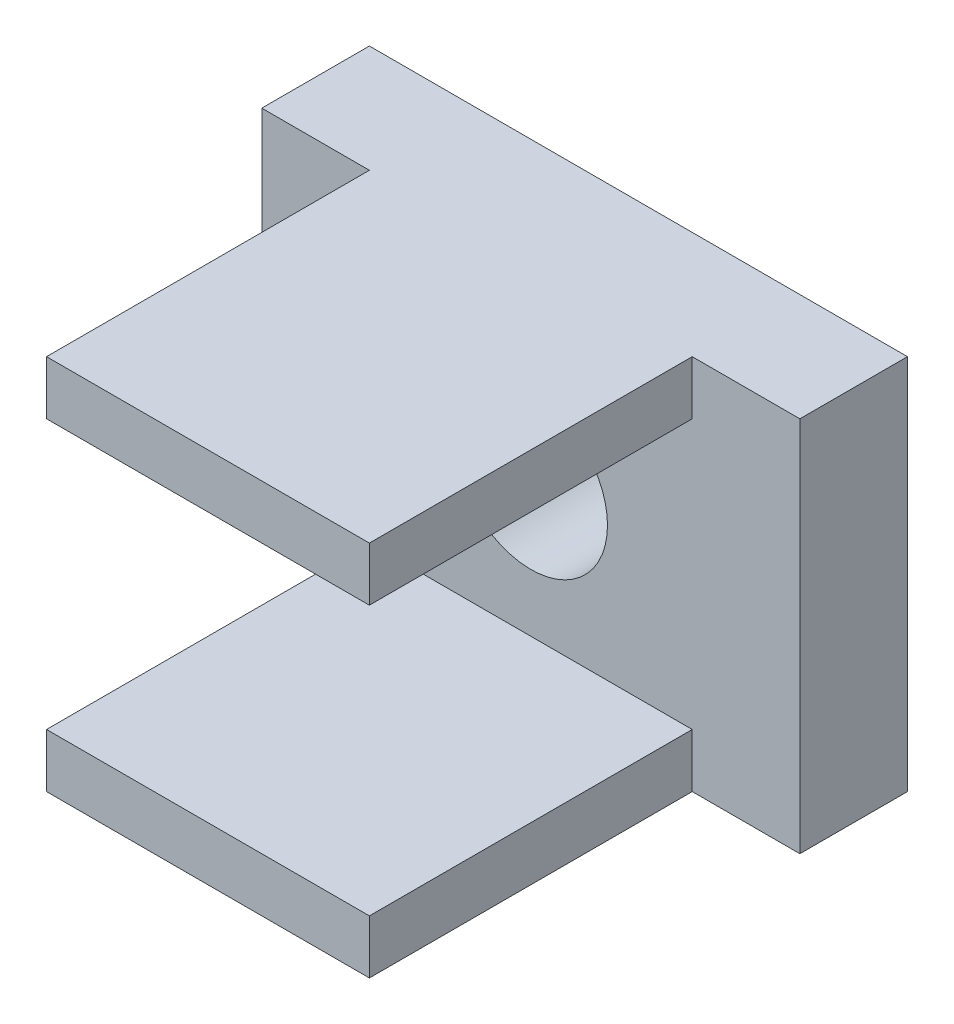
ISO-10303-21;
HEADER;
FILE_DESCRIPTION(('STEP AP214'),'2;1');
FILE_NAME('part.step','',(''),(''),'','','');
FILE_SCHEMA(('AUTOMOTIVE_DESIGN { 1 0 10303 214 1 1 1 1 }'));
ENDSEC;
DATA;
#1=APPLICATION_CONTEXT('core data for automotive mechanical design processes');
#2=APPLICATION_PROTOCOL_DEFINITION('international standard','automotive_design',2000,#1);
#3=PRODUCT_CONTEXT('',#1,'mechanical');
#4=PRODUCT('Part','Part','',(#3));
#5=PRODUCT_RELATED_PRODUCT_CATEGORY('part','',(#4));
#6=PRODUCT_DEFINITION_FORMATION('','',#4);
#7=PRODUCT_DEFINITION_CONTEXT('part definition',#1,'design');
#8=PRODUCT_DEFINITION('design','',#6,#7);
#9=PRODUCT_DEFINITION_SHAPE('','',#8);
#10=(LENGTH_UNIT() NAMED_UNIT(*) SI_UNIT(.MILLI.,.METRE.));
#11=(NAMED_UNIT(*) PLANE_ANGLE_UNIT() SI_UNIT($,.RADIAN.));
#12=(NAMED_UNIT(*) SI_UNIT($,.STERADIAN.) SOLID_ANGLE_UNIT());
#13=UNCERTAINTY_MEASURE_WITH_UNIT(LENGTH_MEASURE(1.E-05),#10,'distance_accuracy_value','');
#14=(GEOMETRIC_REPRESENTATION_CONTEXT(3) GLOBAL_UNCERTAINTY_ASSIGNED_CONTEXT((#13)) GLOBAL_UNIT_ASSIGNED_CONTEXT((#10,
#11,#12)) REPRESENTATION_CONTEXT('',''));
#15=CARTESIAN_POINT('',(0.,0.,0.));
#16=DIRECTION('',(0.,0.,1.));
#17=DIRECTION('',(1.,0.,0.));
#18=AXIS2_PLACEMENT_3D('',#15,#16,#17);
#19=CARTESIAN_POINT('',(0.,0.,1.));
#20=DIRECTION('',(0.,0.,-1.));
#21=DIRECTION('',(-1.,0.,0.));
#22=AXIS2_PLACEMENT_3D('',#19,#20,#21);
#23=PLANE('',#22);
#24=CARTESIAN_POINT('',(0.,0.,1.));
#25=DIRECTION('',(0.,0.,1.));
#26=DIRECTION('',(1.,0.,0.));
#27=AXIS2_PLACEMENT_3D('',#24,#25,#26);
#28=CIRCLE('',#27,1.425);
#29=CARTESIAN_POINT('',(1.425,0.,1.));
#30=VERTEX_POINT('',#29);
#31=EDGE_CURVE('E188',#30,#30,#28,.T.);
#32=ORIENTED_EDGE('',*,*,#31,.F.);
#33=EDGE_LOOP('',(#32));
#34=FACE_BOUND('',#33,.T.);
#35=DIRECTION('',(1.,0.,0.));
#36=VECTOR('',#35,1.);
#37=CARTESIAN_POINT('',(-3.,-2.5,1.));
#38=LINE('',#37,#36);
#39=CARTESIAN_POINT('',(-3.,-2.5,1.));
#40=VERTEX_POINT('',#39);
#41=CARTESIAN_POINT('',(3.,-2.5,1.));
#42=VERTEX_POINT('',#41);
#43=EDGE_CURVE('E49',#40,#42,#38,.T.);
#44=ORIENTED_EDGE('',*,*,#43,.T.);
#45=DIRECTION('',(0.,-1.,0.));
#46=VECTOR('',#45,1.);
#47=CARTESIAN_POINT('',(3.,-2.5,1.));
#48=LINE('',#47,#46);
#49=CARTESIAN_POINT('',(3.,-3.5,1.));
#50=VERTEX_POINT('',#49);
#51=EDGE_CURVE('E129',#42,#50,#48,.T.);
#52=ORIENTED_EDGE('',*,*,#51,.T.);
#53=DIRECTION('',(1.,0.,0.));
#54=VECTOR('',#53,1.);
#55=CARTESIAN_POINT('',(-5.,-3.5,1.));
#56=LINE('',#55,#54);
#57=CARTESIAN_POINT('',(5.,-3.5,1.));
#58=VERTEX_POINT('',#57);
#59=EDGE_CURVE('E204',#50,#58,#56,.T.);
#60=ORIENTED_EDGE('',*,*,#59,.T.);
#61=DIRECTION('',(0.,1.,0.));
#62=VECTOR('',#61,1.);
#63=CARTESIAN_POINT('',(5.,-3.5,1.));
#64=LINE('',#63,#62);
#65=CARTESIAN_POINT('',(5.,3.5,1.));
#66=VERTEX_POINT('',#65);
#67=EDGE_CURVE('E195',#58,#66,#64,.T.);
#68=ORIENTED_EDGE('',*,*,#67,.T.);
#69=DIRECTION('',(-1.,0.,0.));
#70=VECTOR('',#69,1.);
#71=CARTESIAN_POINT('',(-5.,3.5,1.));
#72=LINE('',#71,#70);
#73=CARTESIAN_POINT('',(3.,3.5,1.));
#74=VERTEX_POINT('',#73);
#75=EDGE_CURVE('E200',#66,#74,#72,.T.);
#76=ORIENTED_EDGE('',*,*,#75,.T.);
#77=DIRECTION('',(0.,1.,0.));
#78=VECTOR('',#77,1.);
#79=CARTESIAN_POINT('',(3.,2.5,1.));
#80=LINE('',#79,#78);
#81=CARTESIAN_POINT('',(3.,2.5,1.));
#82=VERTEX_POINT('',#81);
#83=EDGE_CURVE('E132',#82,#74,#80,.T.);
#84=ORIENTED_EDGE('',*,*,#83,.F.);
#85=DIRECTION('',(1.,0.,0.));
#86=VECTOR('',#85,1.);
#87=CARTESIAN_POINT('',(-3.,2.5,1.));
#88=LINE('',#87,#86);
#89=CARTESIAN_POINT('',(-3.,2.5,1.));
#90=VERTEX_POINT('',#89);
#91=EDGE_CURVE('E163',#90,#82,#88,.T.);
#92=ORIENTED_EDGE('',*,*,#91,.F.);
#93=DIRECTION('',(0.,-1.,0.));
#94=VECTOR('',#93,1.);
#95=CARTESIAN_POINT('',(-3.,2.5,1.));
#96=LINE('',#95,#94);
#97=CARTESIAN_POINT('',(-3.,3.5,1.));
#98=VERTEX_POINT('',#97);
#99=EDGE_CURVE('E172',#98,#90,#96,.T.);
#100=ORIENTED_EDGE('',*,*,#99,.F.);
#101=CARTESIAN_POINT('',(-5.,3.5,1.));
#102=VERTEX_POINT('',#101);
#103=EDGE_CURVE('E198',#98,#102,#72,.T.);
#104=ORIENTED_EDGE('',*,*,#103,.T.);
#105=DIRECTION('',(0.,-1.,0.));
#106=VECTOR('',#105,1.);
#107=CARTESIAN_POINT('',(-5.,-3.5,1.));
#108=LINE('',#107,#106);
#109=CARTESIAN_POINT('',(-5.,-3.5,1.));
#110=VERTEX_POINT('',#109);
#111=EDGE_CURVE('E202',#102,#110,#108,.T.);
#112=ORIENTED_EDGE('',*,*,#111,.T.);
#113=CARTESIAN_POINT('',(-3.,-3.5,1.));
#114=VERTEX_POINT('',#113);
#115=EDGE_CURVE('E205',#110,#114,#56,.T.);
#116=ORIENTED_EDGE('',*,*,#115,.T.);
#117=DIRECTION('',(0.,1.,0.));
#118=VECTOR('',#117,1.);
#119=CARTESIAN_POINT('',(-3.,-2.5,1.));
#120=LINE('',#119,#118);
#121=EDGE_CURVE('E54',#114,#40,#120,.T.);
#122=ORIENTED_EDGE('',*,*,#121,.T.);
#123=EDGE_LOOP('',(#44,#52,#60,#68,#76,#84,#92,#100,#104,#112,#116,#122));
#124=FACE_BOUND('',#123,.T.);
#125=ADVANCED_FACE('F34',(#34,#124),#23,.F.);
#126=CARTESIAN_POINT('',(5.,-3.5,1.));
#127=DIRECTION('',(-1.,0.,0.));
#128=DIRECTION('',(0.,0.,1.));
#129=AXIS2_PLACEMENT_3D('',#126,#127,#128);
#130=PLANE('',#129);
#131=DIRECTION('',(0.,1.,0.));
#132=VECTOR('',#131,1.);
#133=CARTESIAN_POINT('',(5.,-3.5,-1.));
#134=LINE('',#133,#132);
#135=CARTESIAN_POINT('',(5.,-3.5,-1.));
#136=VERTEX_POINT('',#135);
#137=CARTESIAN_POINT('',(5.,3.5,-1.));
#138=VERTEX_POINT('',#137);
#139=EDGE_CURVE('E192',#136,#138,#134,.T.);
#140=ORIENTED_EDGE('',*,*,#139,.T.);
#141=DIRECTION('',(0.,0.,-1.));
#142=VECTOR('',#141,1.);
#143=CARTESIAN_POINT('',(5.,3.5,1.));
#144=LINE('',#143,#142);
#145=EDGE_CURVE('E11',#66,#138,#144,.T.);
#146=ORIENTED_EDGE('',*,*,#145,.F.);
#147=ORIENTED_EDGE('',*,*,#67,.F.);
#148=DIRECTION('',(0.,0.,-1.));
#149=VECTOR('',#148,1.);
#150=CARTESIAN_POINT('',(5.,-3.5,1.));
#151=LINE('',#150,#149);
#152=EDGE_CURVE('E207',#58,#136,#151,.T.);
#153=ORIENTED_EDGE('',*,*,#152,.T.);
#154=EDGE_LOOP('',(#140,#146,#147,#153));
#155=FACE_BOUND('',#154,.T.);
#156=ADVANCED_FACE('F36',(#155),#130,.F.);
#157=CARTESIAN_POINT('',(-5.,3.5,1.));
#158=DIRECTION('',(0.,-1.,0.));
#159=DIRECTION('',(0.,0.,-1.));
#160=AXIS2_PLACEMENT_3D('',#157,#158,#159);
#161=PLANE('',#160);
#162=DIRECTION('',(-1.,0.,0.));
#163=VECTOR('',#162,1.);
#164=CARTESIAN_POINT('',(-5.,3.5,-1.));
#165=LINE('',#164,#163);
#166=CARTESIAN_POINT('',(-5.,3.5,-1.));
#167=VERTEX_POINT('',#166);
#168=EDGE_CURVE('E210',#138,#167,#165,.T.);
#169=ORIENTED_EDGE('',*,*,#168,.T.);
#170=DIRECTION('',(0.,0.,-1.));
#171=VECTOR('',#170,1.);
#172=CARTESIAN_POINT('',(-5.,3.5,1.));
#173=LINE('',#172,#171);
#174=EDGE_CURVE('E42',#102,#167,#173,.T.);
#175=ORIENTED_EDGE('',*,*,#174,.F.);
#176=ORIENTED_EDGE('',*,*,#103,.F.);
#177=DIRECTION('',(0.,0.,-1.));
#178=VECTOR('',#177,1.);
#179=CARTESIAN_POINT('',(-3.,3.5,7.));
#180=LINE('',#179,#178);
#181=CARTESIAN_POINT('',(-3.,3.5,7.));
#182=VERTEX_POINT('',#181);
#183=EDGE_CURVE('E182',#182,#98,#180,.T.);
#184=ORIENTED_EDGE('',*,*,#183,.F.);
#185=DIRECTION('',(-1.,0.,0.));
#186=VECTOR('',#185,1.);
#187=CARTESIAN_POINT('',(-3.,3.5,7.));
#188=LINE('',#187,#186);
#189=CARTESIAN_POINT('',(3.,3.5,7.));
#190=VERTEX_POINT('',#189);
#191=EDGE_CURVE('E162',#190,#182,#188,.T.);
#192=ORIENTED_EDGE('',*,*,#191,.F.);
#193=DIRECTION('',(0.,0.,-1.));
#194=VECTOR('',#193,1.);
#195=CARTESIAN_POINT('',(3.,3.5,7.));
#196=LINE('',#195,#194);
#197=EDGE_CURVE('E185',#190,#74,#196,.T.);
#198=ORIENTED_EDGE('',*,*,#197,.T.);
#199=ORIENTED_EDGE('',*,*,#75,.F.);
#200=ORIENTED_EDGE('',*,*,#145,.T.);
#201=EDGE_LOOP('',(#169,#175,#176,#184,#192,#198,#199,#200));
#202=FACE_BOUND('',#201,.T.);
#203=ADVANCED_FACE('F255',(#202),#161,.F.);
#204=CARTESIAN_POINT('',(-5.,-3.5,1.));
#205=DIRECTION('',(1.,0.,0.));
#206=DIRECTION('',(0.,0.,-1.));
#207=AXIS2_PLACEMENT_3D('',#204,#205,#206);
#208=PLANE('',#207);
#209=DIRECTION('',(0.,-1.,0.));
#210=VECTOR('',#209,1.);
#211=CARTESIAN_POINT('',(-5.,-3.5,-1.));
#212=LINE('',#211,#210);
#213=CARTESIAN_POINT('',(-5.,-3.5,-1.));
#214=VERTEX_POINT('',#213);
#215=EDGE_CURVE('E212',#167,#214,#212,.T.);
#216=ORIENTED_EDGE('',*,*,#215,.T.);
#217=DIRECTION('',(0.,0.,-1.));
#218=VECTOR('',#217,1.);
#219=CARTESIAN_POINT('',(-5.,-3.5,1.));
#220=LINE('',#219,#218);
#221=EDGE_CURVE('E217',#110,#214,#220,.T.);
#222=ORIENTED_EDGE('',*,*,#221,.F.);
#223=ORIENTED_EDGE('',*,*,#111,.F.);
#224=ORIENTED_EDGE('',*,*,#174,.T.);
#225=EDGE_LOOP('',(#216,#222,#223,#224));
#226=FACE_BOUND('',#225,.T.);
#227=ADVANCED_FACE('F224',(#226),#208,.F.);
#228=CARTESIAN_POINT('',(-5.,-3.5,1.));
#229=DIRECTION('',(0.,1.,0.));
#230=DIRECTION('',(0.,0.,1.));
#231=AXIS2_PLACEMENT_3D('',#228,#229,#230);
#232=PLANE('',#231);
#233=DIRECTION('',(1.,0.,0.));
#234=VECTOR('',#233,1.);
#235=CARTESIAN_POINT('',(-5.,-3.5,-1.));
#236=LINE('',#235,#234);
#237=EDGE_CURVE('E199',#214,#136,#236,.T.);
#238=ORIENTED_EDGE('',*,*,#237,.T.);
#239=ORIENTED_EDGE('',*,*,#152,.F.);
#240=ORIENTED_EDGE('',*,*,#59,.F.);
#241=DIRECTION('',(0.,0.,-1.));
#242=VECTOR('',#241,1.);
#243=CARTESIAN_POINT('',(3.,-3.5,7.));
#244=LINE('',#243,#242);
#245=CARTESIAN_POINT('',(3.,-3.5,7.));
#246=VERTEX_POINT('',#245);
#247=EDGE_CURVE('E150',#246,#50,#244,.T.);
#248=ORIENTED_EDGE('',*,*,#247,.F.);
#249=DIRECTION('',(-1.,0.,0.));
#250=VECTOR('',#249,1.);
#251=CARTESIAN_POINT('',(-3.,-3.5,7.));
#252=LINE('',#251,#250);
#253=CARTESIAN_POINT('',(-3.,-3.5,7.));
#254=VERTEX_POINT('',#253);
#255=EDGE_CURVE('E142',#246,#254,#252,.T.);
#256=ORIENTED_EDGE('',*,*,#255,.T.);
#257=DIRECTION('',(0.,0.,-1.));
#258=VECTOR('',#257,1.);
#259=CARTESIAN_POINT('',(-3.,-3.5,7.));
#260=LINE('',#259,#258);
#261=EDGE_CURVE('E155',#254,#114,#260,.T.);
#262=ORIENTED_EDGE('',*,*,#261,.T.);
#263=ORIENTED_EDGE('',*,*,#115,.F.);
#264=ORIENTED_EDGE('',*,*,#221,.T.);
#265=EDGE_LOOP('',(#238,#239,#240,#248,#256,#262,#263,#264));
#266=FACE_BOUND('',#265,.T.);
#267=ADVANCED_FACE('F234',(#266),#232,.F.);
#268=CARTESIAN_POINT('',(0.,0.,-1.));
#269=DIRECTION('',(0.,0.,-1.));
#270=DIRECTION('',(-1.,0.,0.));
#271=AXIS2_PLACEMENT_3D('',#268,#269,#270);
#272=PLANE('',#271);
#273=CARTESIAN_POINT('',(0.,0.,-1.));
#274=DIRECTION('',(0.,0.,1.));
#275=DIRECTION('',(1.,0.,0.));
#276=AXIS2_PLACEMENT_3D('',#273,#274,#275);
#277=CIRCLE('',#276,1.425);
#278=CARTESIAN_POINT('',(1.425,0.,-1.));
#279=VERTEX_POINT('',#278);
#280=EDGE_CURVE('E189',#279,#279,#277,.T.);
#281=ORIENTED_EDGE('',*,*,#280,.T.);
#282=EDGE_LOOP('',(#281));
#283=FACE_BOUND('',#282,.T.);
#284=ORIENTED_EDGE('',*,*,#139,.F.);
#285=ORIENTED_EDGE('',*,*,#237,.F.);
#286=ORIENTED_EDGE('',*,*,#215,.F.);
#287=ORIENTED_EDGE('',*,*,#168,.F.);
#288=EDGE_LOOP('',(#284,#285,#286,#287));
#289=FACE_BOUND('',#288,.T.);
#290=ADVANCED_FACE('F231',(#283,#289),#272,.T.);
#291=CARTESIAN_POINT('',(0.,0.,-1.));
#292=DIRECTION('',(0.,0.,1.));
#293=DIRECTION('',(1.,0.,0.));
#294=AXIS2_PLACEMENT_3D('',#291,#292,#293);
#295=CYLINDRICAL_SURFACE('',#294,1.425);
#296=ORIENTED_EDGE('',*,*,#280,.F.);
#297=EDGE_LOOP('',(#296));
#298=FACE_BOUND('',#297,.T.);
#299=ORIENTED_EDGE('',*,*,#31,.T.);
#300=EDGE_LOOP('',(#299));
#301=FACE_BOUND('',#300,.T.);
#302=ADVANCED_FACE('F259',(#298,#301),#295,.F.);
#303=CARTESIAN_POINT('',(3.,2.5,7.));
#304=DIRECTION('',(-1.,0.,0.));
#305=DIRECTION('',(0.,0.,1.));
#306=AXIS2_PLACEMENT_3D('',#303,#304,#305);
#307=PLANE('',#306);
#308=ORIENTED_EDGE('',*,*,#83,.T.);
#309=ORIENTED_EDGE('',*,*,#197,.F.);
#310=DIRECTION('',(0.,1.,0.));
#311=VECTOR('',#310,1.);
#312=CARTESIAN_POINT('',(3.,2.5,7.));
#313=LINE('',#312,#311);
#314=CARTESIAN_POINT('',(3.,2.5,7.));
#315=VERTEX_POINT('',#314);
#316=EDGE_CURVE('E159',#315,#190,#313,.T.);
#317=ORIENTED_EDGE('',*,*,#316,.F.);
#318=DIRECTION('',(0.,0.,-1.));
#319=VECTOR('',#318,1.);
#320=CARTESIAN_POINT('',(3.,2.5,7.));
#321=LINE('',#320,#319);
#322=EDGE_CURVE('E169',#315,#82,#321,.T.);
#323=ORIENTED_EDGE('',*,*,#322,.T.);
#324=EDGE_LOOP('',(#308,#309,#317,#323));
#325=FACE_BOUND('',#324,.T.);
#326=ADVANCED_FACE('F274',(#325),#307,.F.);
#327=CARTESIAN_POINT('',(-3.,2.5,7.));
#328=DIRECTION('',(1.,0.,0.));
#329=DIRECTION('',(0.,0.,-1.));
#330=AXIS2_PLACEMENT_3D('',#327,#328,#329);
#331=PLANE('',#330);
#332=ORIENTED_EDGE('',*,*,#99,.T.);
#333=DIRECTION('',(0.,0.,-1.));
#334=VECTOR('',#333,1.);
#335=CARTESIAN_POINT('',(-3.,2.5,7.));
#336=LINE('',#335,#334);
#337=CARTESIAN_POINT('',(-3.,2.5,7.));
#338=VERTEX_POINT('',#337);
#339=EDGE_CURVE('E179',#338,#90,#336,.T.);
#340=ORIENTED_EDGE('',*,*,#339,.F.);
#341=DIRECTION('',(0.,-1.,0.));
#342=VECTOR('',#341,1.);
#343=CARTESIAN_POINT('',(-3.,2.5,7.));
#344=LINE('',#343,#342);
#345=EDGE_CURVE('E165',#182,#338,#344,.T.);
#346=ORIENTED_EDGE('',*,*,#345,.F.);
#347=ORIENTED_EDGE('',*,*,#183,.T.);
#348=EDGE_LOOP('',(#332,#340,#346,#347));
#349=FACE_BOUND('',#348,.T.);
#350=ADVANCED_FACE('F282',(#349),#331,.F.);
#351=CARTESIAN_POINT('',(-3.,2.5,7.));
#352=DIRECTION('',(0.,1.,0.));
#353=DIRECTION('',(0.,0.,1.));
#354=AXIS2_PLACEMENT_3D('',#351,#352,#353);
#355=PLANE('',#354);
#356=ORIENTED_EDGE('',*,*,#91,.T.);
#357=ORIENTED_EDGE('',*,*,#322,.F.);
#358=DIRECTION('',(1.,0.,0.));
#359=VECTOR('',#358,1.);
#360=CARTESIAN_POINT('',(-3.,2.5,7.));
#361=LINE('',#360,#359);
#362=EDGE_CURVE('E167',#338,#315,#361,.T.);
#363=ORIENTED_EDGE('',*,*,#362,.F.);
#364=ORIENTED_EDGE('',*,*,#339,.T.);
#365=EDGE_LOOP('',(#356,#357,#363,#364));
#366=FACE_BOUND('',#365,.T.);
#367=ADVANCED_FACE('F277',(#366),#355,.F.);
#368=CARTESIAN_POINT('',(0.,0.,7.));
#369=DIRECTION('',(0.,0.,-1.));
#370=DIRECTION('',(-1.,0.,0.));
#371=AXIS2_PLACEMENT_3D('',#368,#369,#370);
#372=PLANE('',#371);
#373=ORIENTED_EDGE('',*,*,#316,.T.);
#374=ORIENTED_EDGE('',*,*,#191,.T.);
#375=ORIENTED_EDGE('',*,*,#345,.T.);
#376=ORIENTED_EDGE('',*,*,#362,.T.);
#377=EDGE_LOOP('',(#373,#374,#375,#376));
#378=FACE_BOUND('',#377,.T.);
#379=ADVANCED_FACE('F284',(#378),#372,.F.);
#380=CARTESIAN_POINT('',(3.,-2.5,7.));
#381=DIRECTION('',(1.,0.,0.));
#382=DIRECTION('',(0.,0.,-1.));
#383=AXIS2_PLACEMENT_3D('',#380,#381,#382);
#384=PLANE('',#383);
#385=ORIENTED_EDGE('',*,*,#51,.F.);
#386=DIRECTION('',(0.,0.,-1.));
#387=VECTOR('',#386,1.);
#388=CARTESIAN_POINT('',(3.,-2.5,7.));
#389=LINE('',#388,#387);
#390=CARTESIAN_POINT('',(3.,-2.5,7.));
#391=VERTEX_POINT('',#390);
#392=EDGE_CURVE('E123',#391,#42,#389,.T.);
#393=ORIENTED_EDGE('',*,*,#392,.F.);
#394=DIRECTION('',(0.,-1.,0.));
#395=VECTOR('',#394,1.);
#396=CARTESIAN_POINT('',(3.,-2.5,7.));
#397=LINE('',#396,#395);
#398=EDGE_CURVE('E127',#391,#246,#397,.T.);
#399=ORIENTED_EDGE('',*,*,#398,.T.);
#400=ORIENTED_EDGE('',*,*,#247,.T.);
#401=EDGE_LOOP('',(#385,#393,#399,#400));
#402=FACE_BOUND('',#401,.T.);
#403=ADVANCED_FACE('F125',(#402),#384,.T.);
#404=CARTESIAN_POINT('',(-3.,-2.5,7.));
#405=DIRECTION('',(0.,1.,0.));
#406=DIRECTION('',(0.,0.,1.));
#407=AXIS2_PLACEMENT_3D('',#404,#405,#406);
#408=PLANE('',#407);
#409=ORIENTED_EDGE('',*,*,#43,.F.);
#410=DIRECTION('',(0.,0.,-1.));
#411=VECTOR('',#410,1.);
#412=CARTESIAN_POINT('',(-3.,-2.5,7.));
#413=LINE('',#412,#411);
#414=CARTESIAN_POINT('',(-3.,-2.5,7.));
#415=VERTEX_POINT('',#414);
#416=EDGE_CURVE('E133',#415,#40,#413,.T.);
#417=ORIENTED_EDGE('',*,*,#416,.F.);
#418=DIRECTION('',(1.,0.,0.));
#419=VECTOR('',#418,1.);
#420=CARTESIAN_POINT('',(-3.,-2.5,7.));
#421=LINE('',#420,#419);
#422=EDGE_CURVE('E139',#415,#391,#421,.T.);
#423=ORIENTED_EDGE('',*,*,#422,.T.);
#424=ORIENTED_EDGE('',*,*,#392,.T.);
#425=EDGE_LOOP('',(#409,#417,#423,#424));
#426=FACE_BOUND('',#425,.T.);
#427=ADVANCED_FACE('F144',(#426),#408,.T.);
#428=CARTESIAN_POINT('',(-3.,-2.5,7.));
#429=DIRECTION('',(-1.,0.,0.));
#430=DIRECTION('',(0.,0.,1.));
#431=AXIS2_PLACEMENT_3D('',#428,#429,#430);
#432=PLANE('',#431);
#433=ORIENTED_EDGE('',*,*,#121,.F.);
#434=ORIENTED_EDGE('',*,*,#261,.F.);
#435=DIRECTION('',(0.,1.,0.));
#436=VECTOR('',#435,1.);
#437=CARTESIAN_POINT('',(-3.,-2.5,7.));
#438=LINE('',#437,#436);
#439=EDGE_CURVE('E145',#254,#415,#438,.T.);
#440=ORIENTED_EDGE('',*,*,#439,.T.);
#441=ORIENTED_EDGE('',*,*,#416,.T.);
#442=EDGE_LOOP('',(#433,#434,#440,#441));
#443=FACE_BOUND('',#442,.T.);
#444=ADVANCED_FACE('F240',(#443),#432,.T.);
#445=CARTESIAN_POINT('',(0.,0.,7.));
#446=DIRECTION('',(0.,0.,-1.));
#447=DIRECTION('',(-1.,0.,0.));
#448=AXIS2_PLACEMENT_3D('',#445,#446,#447);
#449=PLANE('',#448);
#450=ORIENTED_EDGE('',*,*,#398,.F.);
#451=ORIENTED_EDGE('',*,*,#422,.F.);
#452=ORIENTED_EDGE('',*,*,#439,.F.);
#453=ORIENTED_EDGE('',*,*,#255,.F.);
#454=EDGE_LOOP('',(#450,#451,#452,#453));
#455=FACE_BOUND('',#454,.T.);
#456=ADVANCED_FACE('F137',(#455),#449,.F.);
#457=CLOSED_SHELL('',(#125,#156,#203,#227,#267,#290,#302,#326,#350,#367,#379,#403,#427,#444,#456));
#458=MANIFOLD_SOLID_BREP('B2',#457);
#459=ADVANCED_BREP_SHAPE_REPRESENTATION('',(#18,#458),#14);
#460=SHAPE_DEFINITION_REPRESENTATION(#9,#459);
ENDSEC;
END-ISO-10303-21;
